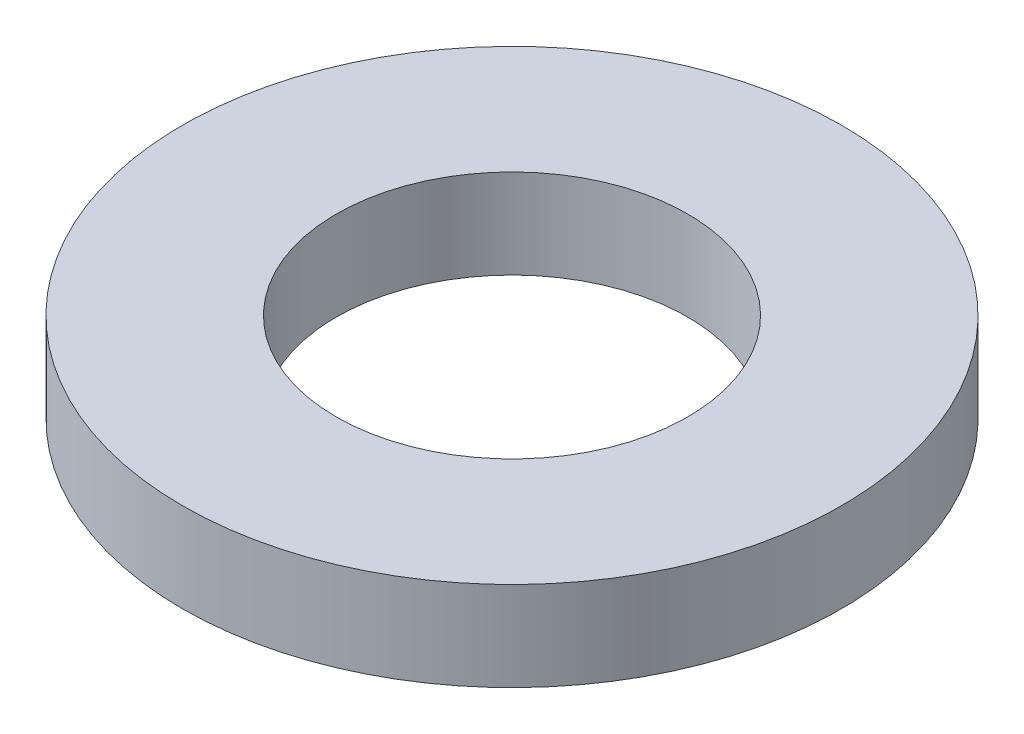
ISO-10303-21;
HEADER;
FILE_DESCRIPTION(('STEP AP214'),'2;1');
FILE_NAME('part.step','',(''),(''),'','','');
FILE_SCHEMA(('AUTOMOTIVE_DESIGN { 1 0 10303 214 1 1 1 1 }'));
ENDSEC;
DATA;
#1=APPLICATION_CONTEXT('core data for automotive mechanical design processes');
#2=APPLICATION_PROTOCOL_DEFINITION('international standard','automotive_design',2000,#1);
#3=PRODUCT_CONTEXT('',#1,'mechanical');
#4=PRODUCT('Part','Part','',(#3));
#5=PRODUCT_RELATED_PRODUCT_CATEGORY('part','',(#4));
#6=PRODUCT_DEFINITION_FORMATION('','',#4);
#7=PRODUCT_DEFINITION_CONTEXT('part definition',#1,'design');
#8=PRODUCT_DEFINITION('design','',#6,#7);
#9=PRODUCT_DEFINITION_SHAPE('','',#8);
#10=(LENGTH_UNIT() NAMED_UNIT(*) SI_UNIT(.MILLI.,.METRE.));
#11=(NAMED_UNIT(*) PLANE_ANGLE_UNIT() SI_UNIT($,.RADIAN.));
#12=(NAMED_UNIT(*) SI_UNIT($,.STERADIAN.) SOLID_ANGLE_UNIT());
#13=UNCERTAINTY_MEASURE_WITH_UNIT(LENGTH_MEASURE(1.E-05),#10,'distance_accuracy_value','');
#14=(GEOMETRIC_REPRESENTATION_CONTEXT(3) GLOBAL_UNCERTAINTY_ASSIGNED_CONTEXT((#13)) GLOBAL_UNIT_ASSIGNED_CONTEXT((#10,
#11,#12)) REPRESENTATION_CONTEXT('',''));
#15=CARTESIAN_POINT('',(0.,0.,0.));
#16=DIRECTION('',(0.,0.,1.));
#17=DIRECTION('',(1.,0.,0.));
#18=AXIS2_PLACEMENT_3D('',#15,#16,#17);
#19=CARTESIAN_POINT('',(0.,3.2258,0.));
#20=DIRECTION('',(0.,1.,0.));
#21=DIRECTION('',(0.,0.,1.));
#22=AXIS2_PLACEMENT_3D('',#19,#20,#21);
#23=PLANE('',#22);
#24=CARTESIAN_POINT('',(0.,3.2258,0.));
#25=DIRECTION('',(0.,1.,0.));
#26=DIRECTION('',(0.,0.,1.));
#27=AXIS2_PLACEMENT_3D('',#24,#25,#26);
#28=CIRCLE('',#27,11.90625);
#29=CARTESIAN_POINT('',(0.,3.2258,11.90625));
#30=VERTEX_POINT('',#29);
#31=EDGE_CURVE('E10',#30,#30,#28,.T.);
#32=ORIENTED_EDGE('',*,*,#31,.T.);
#33=EDGE_LOOP('',(#32));
#34=FACE_BOUND('',#33,.T.);
#35=CARTESIAN_POINT('',(0.,3.2258,0.));
#36=DIRECTION('',(0.,1.,0.));
#37=DIRECTION('',(0.,0.,1.));
#38=AXIS2_PLACEMENT_3D('',#35,#36,#37);
#39=CIRCLE('',#38,6.35);
#40=CARTESIAN_POINT('',(0.,3.2258,6.35));
#41=VERTEX_POINT('',#40);
#42=EDGE_CURVE('E48',#41,#41,#39,.T.);
#43=ORIENTED_EDGE('',*,*,#42,.F.);
#44=EDGE_LOOP('',(#43));
#45=FACE_BOUND('',#44,.T.);
#46=ADVANCED_FACE('F37',(#34,#45),#23,.T.);
#47=CARTESIAN_POINT('',(0.,0.,0.));
#48=DIRECTION('',(0.,1.,0.));
#49=DIRECTION('',(0.,0.,1.));
#50=AXIS2_PLACEMENT_3D('',#47,#48,#49);
#51=PLANE('',#50);
#52=CARTESIAN_POINT('',(0.,0.,0.));
#53=DIRECTION('',(0.,1.,0.));
#54=DIRECTION('',(0.,0.,1.));
#55=AXIS2_PLACEMENT_3D('',#52,#53,#54);
#56=CIRCLE('',#55,11.90625);
#57=CARTESIAN_POINT('',(0.,0.,11.90625));
#58=VERTEX_POINT('',#57);
#59=EDGE_CURVE('E41',#58,#58,#56,.T.);
#60=ORIENTED_EDGE('',*,*,#59,.F.);
#61=EDGE_LOOP('',(#60));
#62=FACE_BOUND('',#61,.T.);
#63=CARTESIAN_POINT('',(0.,0.,0.));
#64=DIRECTION('',(0.,1.,0.));
#65=DIRECTION('',(0.,0.,1.));
#66=AXIS2_PLACEMENT_3D('',#63,#64,#65);
#67=CIRCLE('',#66,6.35);
#68=CARTESIAN_POINT('',(0.,0.,6.35));
#69=VERTEX_POINT('',#68);
#70=EDGE_CURVE('E50',#69,#69,#67,.T.);
#71=ORIENTED_EDGE('',*,*,#70,.T.);
#72=EDGE_LOOP('',(#71));
#73=FACE_BOUND('',#72,.T.);
#74=ADVANCED_FACE('F60',(#62,#73),#51,.F.);
#75=CARTESIAN_POINT('',(0.,3.2258,0.));
#76=DIRECTION('',(0.,-1.,0.));
#77=DIRECTION('',(0.,0.,-1.));
#78=AXIS2_PLACEMENT_3D('',#75,#76,#77);
#79=CYLINDRICAL_SURFACE('',#78,11.90625);
#80=ORIENTED_EDGE('',*,*,#31,.F.);
#81=EDGE_LOOP('',(#80));
#82=FACE_BOUND('',#81,.T.);
#83=ORIENTED_EDGE('',*,*,#59,.T.);
#84=EDGE_LOOP('',(#83));
#85=FACE_BOUND('',#84,.T.);
#86=ADVANCED_FACE('F39',(#82,#85),#79,.T.);
#87=CARTESIAN_POINT('',(0.,3.2258,0.));
#88=DIRECTION('',(0.,-1.,0.));
#89=DIRECTION('',(0.,0.,-1.));
#90=AXIS2_PLACEMENT_3D('',#87,#88,#89);
#91=CYLINDRICAL_SURFACE('',#90,6.35);
#92=ORIENTED_EDGE('',*,*,#42,.T.);
#93=EDGE_LOOP('',(#92));
#94=FACE_BOUND('',#93,.T.);
#95=ORIENTED_EDGE('',*,*,#70,.F.);
#96=EDGE_LOOP('',(#95));
#97=FACE_BOUND('',#96,.T.);
#98=ADVANCED_FACE('F56',(#94,#97),#91,.F.);
#99=CLOSED_SHELL('',(#46,#74,#86,#98));
#100=MANIFOLD_SOLID_BREP('B2',#99);
#101=ADVANCED_BREP_SHAPE_REPRESENTATION('',(#18,#100),#14);
#102=SHAPE_DEFINITION_REPRESENTATION(#9,#101);
ENDSEC;
END-ISO-10303-21;
